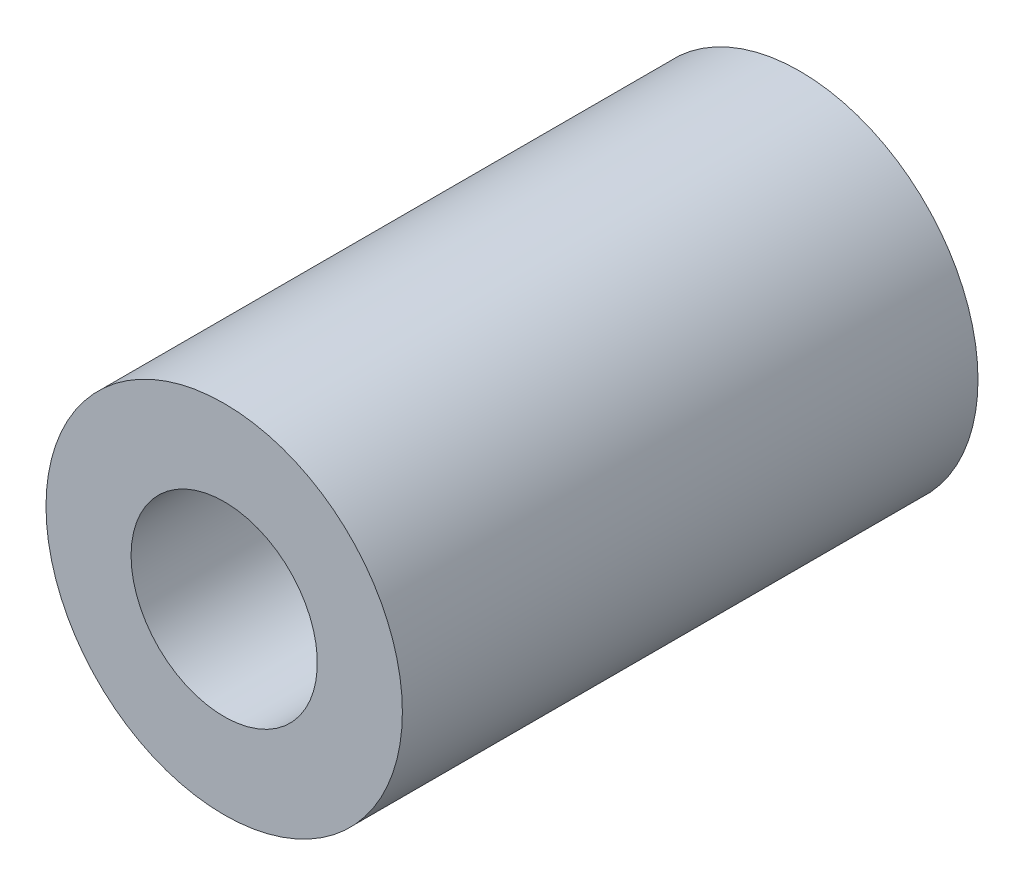
ISO-10303-21;
HEADER;
FILE_DESCRIPTION(('STEP AP214'),'2;1');
FILE_NAME('part.step','',(''),(''),'','','');
FILE_SCHEMA(('AUTOMOTIVE_DESIGN { 1 0 10303 214 1 1 1 1 }'));
ENDSEC;
DATA;
#1=APPLICATION_CONTEXT('core data for automotive mechanical design processes');
#2=APPLICATION_PROTOCOL_DEFINITION('international standard','automotive_design',2000,#1);
#3=PRODUCT_CONTEXT('',#1,'mechanical');
#4=PRODUCT('Part','Part','',(#3));
#5=PRODUCT_RELATED_PRODUCT_CATEGORY('part','',(#4));
#6=PRODUCT_DEFINITION_FORMATION('','',#4);
#7=PRODUCT_DEFINITION_CONTEXT('part definition',#1,'design');
#8=PRODUCT_DEFINITION('design','',#6,#7);
#9=PRODUCT_DEFINITION_SHAPE('','',#8);
#10=(LENGTH_UNIT() NAMED_UNIT(*) SI_UNIT(.MILLI.,.METRE.));
#11=(NAMED_UNIT(*) PLANE_ANGLE_UNIT() SI_UNIT($,.RADIAN.));
#12=(NAMED_UNIT(*) SI_UNIT($,.STERADIAN.) SOLID_ANGLE_UNIT());
#13=UNCERTAINTY_MEASURE_WITH_UNIT(LENGTH_MEASURE(1.E-05),#10,'distance_accuracy_value','');
#14=(GEOMETRIC_REPRESENTATION_CONTEXT(3) GLOBAL_UNCERTAINTY_ASSIGNED_CONTEXT((#13)) GLOBAL_UNIT_ASSIGNED_CONTEXT((#10,
#11,#12)) REPRESENTATION_CONTEXT('',''));
#15=CARTESIAN_POINT('',(0.,0.,0.));
#16=DIRECTION('',(0.,0.,1.));
#17=DIRECTION('',(1.,0.,0.));
#18=AXIS2_PLACEMENT_3D('',#15,#16,#17);
#19=CARTESIAN_POINT('',(0.,0.,7.69239));
#20=DIRECTION('',(0.,0.,1.));
#21=DIRECTION('',(1.,0.,0.));
#22=AXIS2_PLACEMENT_3D('',#19,#20,#21);
#23=PLANE('',#22);
#24=CARTESIAN_POINT('',(0.,0.,7.69239));
#25=DIRECTION('',(0.,0.,1.));
#26=DIRECTION('',(1.,0.,0.));
#27=AXIS2_PLACEMENT_3D('',#24,#25,#26);
#28=CIRCLE('',#27,4.7625);
#29=CARTESIAN_POINT('',(-4.7625,0.,7.69239));
#30=VERTEX_POINT('',#29);
#31=EDGE_CURVE('E11',#30,#30,#28,.T.);
#32=ORIENTED_EDGE('',*,*,#31,.T.);
#33=EDGE_LOOP('',(#32));
#34=FACE_BOUND('',#33,.T.);
#35=CARTESIAN_POINT('',(0.,0.,7.69239));
#36=DIRECTION('',(0.,0.,1.));
#37=DIRECTION('',(1.,0.,0.));
#38=AXIS2_PLACEMENT_3D('',#35,#36,#37);
#39=CIRCLE('',#38,2.4892);
#40=CARTESIAN_POINT('',(-2.4892,0.,7.69239));
#41=VERTEX_POINT('',#40);
#42=EDGE_CURVE('E62',#41,#41,#39,.T.);
#43=ORIENTED_EDGE('',*,*,#42,.F.);
#44=EDGE_LOOP('',(#43));
#45=FACE_BOUND('',#44,.T.);
#46=ADVANCED_FACE('F49',(#34,#45),#23,.T.);
#47=CARTESIAN_POINT('',(0.,0.,-7.69239));
#48=DIRECTION('',(0.,0.,1.));
#49=DIRECTION('',(1.,0.,0.));
#50=AXIS2_PLACEMENT_3D('',#47,#48,#49);
#51=PLANE('',#50);
#52=CARTESIAN_POINT('',(0.,0.,-7.69239));
#53=DIRECTION('',(0.,0.,1.));
#54=DIRECTION('',(1.,0.,0.));
#55=AXIS2_PLACEMENT_3D('',#52,#53,#54);
#56=CIRCLE('',#55,4.7625);
#57=CARTESIAN_POINT('',(-4.7625,0.,-7.69239));
#58=VERTEX_POINT('',#57);
#59=EDGE_CURVE('E53',#58,#58,#56,.T.);
#60=ORIENTED_EDGE('',*,*,#59,.F.);
#61=EDGE_LOOP('',(#60));
#62=FACE_BOUND('',#61,.T.);
#63=CARTESIAN_POINT('',(0.,0.,-7.69239));
#64=DIRECTION('',(0.,0.,1.));
#65=DIRECTION('',(1.,0.,0.));
#66=AXIS2_PLACEMENT_3D('',#63,#64,#65);
#67=CIRCLE('',#66,2.4892);
#68=CARTESIAN_POINT('',(-2.4892,0.,-7.69239));
#69=VERTEX_POINT('',#68);
#70=EDGE_CURVE('E64',#69,#69,#67,.T.);
#71=ORIENTED_EDGE('',*,*,#70,.T.);
#72=EDGE_LOOP('',(#71));
#73=FACE_BOUND('',#72,.T.);
#74=ADVANCED_FACE('F76',(#62,#73),#51,.F.);
#75=CARTESIAN_POINT('',(0.,0.,7.69239));
#76=DIRECTION('',(0.,0.,-1.));
#77=DIRECTION('',(-1.,0.,0.));
#78=AXIS2_PLACEMENT_3D('',#75,#76,#77);
#79=CYLINDRICAL_SURFACE('',#78,4.7625);
#80=CARTESIAN_POINT('',(-4.7625,0.,7.69239));
#81=CARTESIAN_POINT('',(-4.7625,0.,7.532131875));
#82=CARTESIAN_POINT('',(-4.7625,0.,7.37187375));
#83=CARTESIAN_POINT('',(-4.7625,0.,7.0513575));
#84=CARTESIAN_POINT('',(-4.7625,0.,6.891099375));
#85=CARTESIAN_POINT('',(-4.7625,0.,6.570583125));
#86=CARTESIAN_POINT('',(-4.7625,0.,6.410325));
#87=CARTESIAN_POINT('',(-4.7625,0.,6.08980875));
#88=CARTESIAN_POINT('',(-4.7625,0.,5.929550625));
#89=CARTESIAN_POINT('',(-4.7625,0.,5.609034375));
#90=CARTESIAN_POINT('',(-4.7625,0.,5.44877625));
#91=CARTESIAN_POINT('',(-4.7625,0.,5.12826));
#92=CARTESIAN_POINT('',(-4.7625,0.,4.968001875));
#93=CARTESIAN_POINT('',(-4.7625,0.,4.647485625));
#94=CARTESIAN_POINT('',(-4.7625,0.,4.4872275));
#95=CARTESIAN_POINT('',(-4.7625,0.,4.16671125));
#96=CARTESIAN_POINT('',(-4.7625,0.,4.006453125));
#97=CARTESIAN_POINT('',(-4.7625,0.,3.685936875));
#98=CARTESIAN_POINT('',(-4.7625,0.,3.52567875));
#99=CARTESIAN_POINT('',(-4.7625,0.,3.2051625));
#100=CARTESIAN_POINT('',(-4.7625,0.,3.044904375));
#101=CARTESIAN_POINT('',(-4.7625,0.,2.724388125));
#102=CARTESIAN_POINT('',(-4.7625,0.,2.56413));
#103=CARTESIAN_POINT('',(-4.7625,0.,2.24361375));
#104=CARTESIAN_POINT('',(-4.7625,0.,2.083355625));
#105=CARTESIAN_POINT('',(-4.7625,0.,1.762839375));
#106=CARTESIAN_POINT('',(-4.7625,0.,1.60258125));
#107=CARTESIAN_POINT('',(-4.7625,0.,1.282065));
#108=CARTESIAN_POINT('',(-4.7625,0.,1.121806875));
#109=CARTESIAN_POINT('',(-4.7625,0.,0.801290624999998));
#110=CARTESIAN_POINT('',(-4.7625,0.,0.641032499999999));
#111=CARTESIAN_POINT('',(-4.7625,0.,0.320516249999999));
#112=CARTESIAN_POINT('',(-4.7625,0.,0.160258124999998));
#113=CARTESIAN_POINT('',(-4.7625,0.,-0.160258125000001));
#114=CARTESIAN_POINT('',(-4.7625,0.,-0.32051625));
#115=CARTESIAN_POINT('',(-4.7625,0.,-0.6410325));
#116=CARTESIAN_POINT('',(-4.7625,0.,-0.801290625));
#117=CARTESIAN_POINT('',(-4.7625,0.,-1.121806875));
#118=CARTESIAN_POINT('',(-4.7625,0.,-1.282065));
#119=CARTESIAN_POINT('',(-4.7625,0.,-1.60258125));
#120=CARTESIAN_POINT('',(-4.7625,0.,-1.762839375));
#121=CARTESIAN_POINT('',(-4.7625,0.,-2.083355625));
#122=CARTESIAN_POINT('',(-4.7625,0.,-2.24361375));
#123=CARTESIAN_POINT('',(-4.7625,0.,-2.56413));
#124=CARTESIAN_POINT('',(-4.7625,0.,-2.724388125));
#125=CARTESIAN_POINT('',(-4.7625,0.,-3.044904375));
#126=CARTESIAN_POINT('',(-4.7625,0.,-3.2051625));
#127=CARTESIAN_POINT('',(-4.7625,0.,-3.52567875));
#128=CARTESIAN_POINT('',(-4.7625,0.,-3.685936875));
#129=CARTESIAN_POINT('',(-4.7625,0.,-4.006453125));
#130=CARTESIAN_POINT('',(-4.7625,0.,-4.16671125));
#131=CARTESIAN_POINT('',(-4.7625,0.,-4.4872275));
#132=CARTESIAN_POINT('',(-4.7625,0.,-4.647485625));
#133=CARTESIAN_POINT('',(-4.7625,0.,-4.968001875));
#134=CARTESIAN_POINT('',(-4.7625,0.,-5.12826));
#135=CARTESIAN_POINT('',(-4.7625,0.,-5.44877625));
#136=CARTESIAN_POINT('',(-4.7625,0.,-5.609034375));
#137=CARTESIAN_POINT('',(-4.7625,0.,-5.929550625));
#138=CARTESIAN_POINT('',(-4.7625,0.,-6.08980875));
#139=CARTESIAN_POINT('',(-4.7625,0.,-6.410325));
#140=CARTESIAN_POINT('',(-4.7625,0.,-6.570583125));
#141=CARTESIAN_POINT('',(-4.7625,0.,-6.891099375));
#142=CARTESIAN_POINT('',(-4.7625,0.,-7.0513575));
#143=CARTESIAN_POINT('',(-4.7625,0.,-7.37187375));
#144=CARTESIAN_POINT('',(-4.7625,0.,-7.532131875));
#145=CARTESIAN_POINT('',(-4.7625,0.,-7.69239));
#146=B_SPLINE_CURVE_WITH_KNOTS('',3,(#80,#81,#82,#83,#84,#85,#86,#87,#88,#89,#90,#91,#92,#93,
#94,#95,#96,#97,#98,#99,#100,#101,#102,#103,#104,#105,#106,#107,#108,#109,#110,#111,#112,#113,
#114,#115,#116,#117,#118,#119,#120,#121,#122,#123,#124,#125,#126,#127,#128,#129,#130,#131,#132,
#133,#134,#135,#136,#137,#138,#139,#140,#141,#142,#143,#144,#145),.UNSPECIFIED.,.F.,.F.,(4,2,2,
2,2,2,2,2,2,2,2,2,2,2,2,2,2,2,2,2,2,2,2,2,2,2,2,2,2,2,2,2,4),(0.,0.480774375,0.96154875,
1.442323125,1.9230975,2.403871875,2.88464625,3.365420625,3.846195,4.326969375,4.80774375,
5.288518125,5.7692925,6.250066875,6.73084125,7.211615625,7.69239,8.173164375,8.65393875,
9.134713125,9.6154875,10.096261875,10.57703625,11.057810625,11.538585,12.019359375,12.50013375,
12.980908125,13.4616825,13.942456875,14.42323125,14.904005625,15.38478),.UNSPECIFIED.);
#147=EDGE_CURVE('BSEAM51',#30,#58,#146,.T.);
#148=ORIENTED_EDGE('',*,*,#31,.F.);
#149=ORIENTED_EDGE('',*,*,#59,.T.);
#150=ORIENTED_EDGE('',*,*,#147,.T.);
#151=ORIENTED_EDGE('',*,*,#147,.F.);
#152=EDGE_LOOP('',(#148,#150,#149,#151));
#153=FACE_BOUND('',#152,.T.);
#154=ADVANCED_FACE('F51',(#153),#79,.T.);
#155=CARTESIAN_POINT('',(0.,0.,7.69239));
#156=DIRECTION('',(0.,0.,-1.));
#157=DIRECTION('',(-1.,0.,0.));
#158=AXIS2_PLACEMENT_3D('',#155,#156,#157);
#159=CYLINDRICAL_SURFACE('',#158,2.4892);
#160=CARTESIAN_POINT('',(-2.4892,0.,7.69239));
#161=CARTESIAN_POINT('',(-2.4892,0.,7.532131875));
#162=CARTESIAN_POINT('',(-2.4892,0.,7.37187375));
#163=CARTESIAN_POINT('',(-2.4892,0.,7.0513575));
#164=CARTESIAN_POINT('',(-2.4892,0.,6.891099375));
#165=CARTESIAN_POINT('',(-2.4892,0.,6.570583125));
#166=CARTESIAN_POINT('',(-2.4892,0.,6.410325));
#167=CARTESIAN_POINT('',(-2.4892,0.,6.08980875));
#168=CARTESIAN_POINT('',(-2.4892,0.,5.929550625));
#169=CARTESIAN_POINT('',(-2.4892,0.,5.609034375));
#170=CARTESIAN_POINT('',(-2.4892,0.,5.44877625));
#171=CARTESIAN_POINT('',(-2.4892,0.,5.12826));
#172=CARTESIAN_POINT('',(-2.4892,0.,4.968001875));
#173=CARTESIAN_POINT('',(-2.4892,0.,4.647485625));
#174=CARTESIAN_POINT('',(-2.4892,0.,4.4872275));
#175=CARTESIAN_POINT('',(-2.4892,0.,4.16671125));
#176=CARTESIAN_POINT('',(-2.4892,0.,4.006453125));
#177=CARTESIAN_POINT('',(-2.4892,0.,3.685936875));
#178=CARTESIAN_POINT('',(-2.4892,0.,3.52567875));
#179=CARTESIAN_POINT('',(-2.4892,0.,3.2051625));
#180=CARTESIAN_POINT('',(-2.4892,0.,3.044904375));
#181=CARTESIAN_POINT('',(-2.4892,0.,2.724388125));
#182=CARTESIAN_POINT('',(-2.4892,0.,2.56413));
#183=CARTESIAN_POINT('',(-2.4892,0.,2.24361375));
#184=CARTESIAN_POINT('',(-2.4892,0.,2.083355625));
#185=CARTESIAN_POINT('',(-2.4892,0.,1.762839375));
#186=CARTESIAN_POINT('',(-2.4892,0.,1.60258125));
#187=CARTESIAN_POINT('',(-2.4892,0.,1.282065));
#188=CARTESIAN_POINT('',(-2.4892,0.,1.121806875));
#189=CARTESIAN_POINT('',(-2.4892,0.,0.801290624999999));
#190=CARTESIAN_POINT('',(-2.4892,0.,0.641032499999999));
#191=CARTESIAN_POINT('',(-2.4892,0.,0.320516249999999));
#192=CARTESIAN_POINT('',(-2.4892,0.,0.160258124999999));
#193=CARTESIAN_POINT('',(-2.4892,0.,-0.160258125));
#194=CARTESIAN_POINT('',(-2.4892,0.,-0.32051625));
#195=CARTESIAN_POINT('',(-2.4892,0.,-0.6410325));
#196=CARTESIAN_POINT('',(-2.4892,0.,-0.801290625));
#197=CARTESIAN_POINT('',(-2.4892,0.,-1.121806875));
#198=CARTESIAN_POINT('',(-2.4892,0.,-1.282065));
#199=CARTESIAN_POINT('',(-2.4892,0.,-1.60258125));
#200=CARTESIAN_POINT('',(-2.4892,0.,-1.762839375));
#201=CARTESIAN_POINT('',(-2.4892,0.,-2.083355625));
#202=CARTESIAN_POINT('',(-2.4892,0.,-2.24361375));
#203=CARTESIAN_POINT('',(-2.4892,0.,-2.56413));
#204=CARTESIAN_POINT('',(-2.4892,0.,-2.724388125));
#205=CARTESIAN_POINT('',(-2.4892,0.,-3.044904375));
#206=CARTESIAN_POINT('',(-2.4892,0.,-3.2051625));
#207=CARTESIAN_POINT('',(-2.4892,0.,-3.52567875));
#208=CARTESIAN_POINT('',(-2.4892,0.,-3.685936875));
#209=CARTESIAN_POINT('',(-2.4892,0.,-4.006453125));
#210=CARTESIAN_POINT('',(-2.4892,0.,-4.16671125));
#211=CARTESIAN_POINT('',(-2.4892,0.,-4.4872275));
#212=CARTESIAN_POINT('',(-2.4892,0.,-4.647485625));
#213=CARTESIAN_POINT('',(-2.4892,0.,-4.968001875));
#214=CARTESIAN_POINT('',(-2.4892,0.,-5.12826));
#215=CARTESIAN_POINT('',(-2.4892,0.,-5.44877625));
#216=CARTESIAN_POINT('',(-2.4892,0.,-5.609034375));
#217=CARTESIAN_POINT('',(-2.4892,0.,-5.929550625));
#218=CARTESIAN_POINT('',(-2.4892,0.,-6.08980875));
#219=CARTESIAN_POINT('',(-2.4892,0.,-6.410325));
#220=CARTESIAN_POINT('',(-2.4892,0.,-6.570583125));
#221=CARTESIAN_POINT('',(-2.4892,0.,-6.891099375));
#222=CARTESIAN_POINT('',(-2.4892,0.,-7.0513575));
#223=CARTESIAN_POINT('',(-2.4892,0.,-7.37187375));
#224=CARTESIAN_POINT('',(-2.4892,0.,-7.532131875));
#225=CARTESIAN_POINT('',(-2.4892,0.,-7.69239));
#226=B_SPLINE_CURVE_WITH_KNOTS('',3,(#160,#161,#162,#163,#164,#165,#166,#167,#168,#169,#170,
#171,#172,#173,#174,#175,#176,#177,#178,#179,#180,#181,#182,#183,#184,#185,#186,#187,#188,#189,
#190,#191,#192,#193,#194,#195,#196,#197,#198,#199,#200,#201,#202,#203,#204,#205,#206,#207,#208,
#209,#210,#211,#212,#213,#214,#215,#216,#217,#218,#219,#220,#221,#222,#223,#224,#225),
.UNSPECIFIED.,.F.,.F.,(4,2,2,2,2,2,2,2,2,2,2,2,2,2,2,2,2,2,2,2,2,2,2,2,2,2,2,2,2,2,2,2,4),(0.,
0.480774375,0.961548750000001,1.442323125,1.9230975,2.403871875,2.88464625,3.365420625,3.846195,
4.326969375,4.80774375,5.288518125,5.7692925,6.250066875,6.73084125,7.211615625,7.69239,
8.173164375,8.65393875,9.134713125,9.6154875,10.096261875,10.57703625,11.057810625,11.538585,
12.019359375,12.50013375,12.980908125,13.4616825,13.942456875,14.42323125,14.904005625,
15.38478),.UNSPECIFIED.);
#227=EDGE_CURVE('BSEAM72',#41,#69,#226,.T.);
#228=ORIENTED_EDGE('',*,*,#42,.T.);
#229=ORIENTED_EDGE('',*,*,#70,.F.);
#230=ORIENTED_EDGE('',*,*,#227,.T.);
#231=ORIENTED_EDGE('',*,*,#227,.F.);
#232=EDGE_LOOP('',(#228,#230,#229,#231));
#233=FACE_BOUND('',#232,.T.);
#234=ADVANCED_FACE('F72',(#233),#159,.F.);
#235=CLOSED_SHELL('',(#46,#74,#154,#234));
#236=MANIFOLD_SOLID_BREP('B2',#235);
#237=ADVANCED_BREP_SHAPE_REPRESENTATION('',(#18,#236),#14);
#238=SHAPE_DEFINITION_REPRESENTATION(#9,#237);
ENDSEC;
END-ISO-10303-21;
